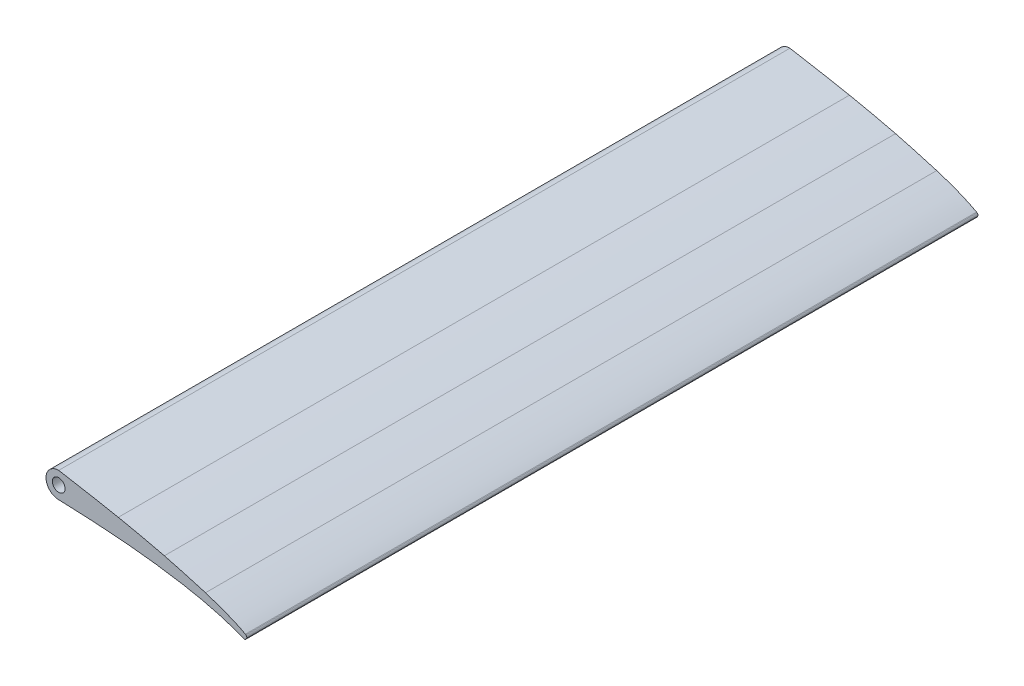
ISO-10303-21;
HEADER;
FILE_DESCRIPTION(('STEP AP214'),'2;1');
FILE_NAME('part.step','',(''),(''),'','','');
FILE_SCHEMA(('AUTOMOTIVE_DESIGN { 1 0 10303 214 1 1 1 1 }'));
ENDSEC;
DATA;
#1=APPLICATION_CONTEXT('core data for automotive mechanical design processes');
#2=APPLICATION_PROTOCOL_DEFINITION('international standard','automotive_design',2000,#1);
#3=PRODUCT_CONTEXT('',#1,'mechanical');
#4=PRODUCT('Part','Part','',(#3));
#5=PRODUCT_RELATED_PRODUCT_CATEGORY('part','',(#4));
#6=PRODUCT_DEFINITION_FORMATION('','',#4);
#7=PRODUCT_DEFINITION_CONTEXT('part definition',#1,'design');
#8=PRODUCT_DEFINITION('design','',#6,#7);
#9=PRODUCT_DEFINITION_SHAPE('','',#8);
#10=(LENGTH_UNIT() NAMED_UNIT(*) SI_UNIT(.MILLI.,.METRE.));
#11=(NAMED_UNIT(*) PLANE_ANGLE_UNIT() SI_UNIT($,.RADIAN.));
#12=(NAMED_UNIT(*) SI_UNIT($,.STERADIAN.) SOLID_ANGLE_UNIT());
#13=UNCERTAINTY_MEASURE_WITH_UNIT(LENGTH_MEASURE(1.E-05),#10,'distance_accuracy_value','');
#14=(GEOMETRIC_REPRESENTATION_CONTEXT(3) GLOBAL_UNCERTAINTY_ASSIGNED_CONTEXT((#13)) GLOBAL_UNIT_ASSIGNED_CONTEXT((#10,
#11,#12)) REPRESENTATION_CONTEXT('',''));
#15=CARTESIAN_POINT('',(0.,0.,0.));
#16=DIRECTION('',(0.,0.,1.));
#17=DIRECTION('',(1.,0.,0.));
#18=AXIS2_PLACEMENT_3D('',#15,#16,#17);
#19=CARTESIAN_POINT('',(136.000000000001,15.5,415.));
#20=DIRECTION('',(0.,0.,-1.));
#21=DIRECTION('',(-1.,0.,0.));
#22=AXIS2_PLACEMENT_3D('',#19,#20,#21);
#23=CYLINDRICAL_SURFACE('',#22,3.99999999999999);
#24=CARTESIAN_POINT('',(136.000000000001,15.5,185.));
#25=DIRECTION('',(0.,0.,1.));
#26=DIRECTION('',(1.,0.,0.));
#27=AXIS2_PLACEMENT_3D('',#24,#25,#26);
#28=CIRCLE('',#27,3.99999999999999);
#29=CARTESIAN_POINT('',(136.000000000001,19.5,185.));
#30=VERTEX_POINT('',#29);
#31=CARTESIAN_POINT('',(136.000000000001,11.5,185.));
#32=VERTEX_POINT('',#31);
#33=EDGE_CURVE('E166',#30,#32,#28,.T.);
#34=ORIENTED_EDGE('',*,*,#33,.T.);
#35=DIRECTION('',(0.,0.,-1.));
#36=VECTOR('',#35,1.);
#37=CARTESIAN_POINT('',(136.000000000001,11.5,415.));
#38=LINE('',#37,#36);
#39=CARTESIAN_POINT('',(136.000000000001,11.5,415.));
#40=VERTEX_POINT('',#39);
#41=EDGE_CURVE('E164',#40,#32,#38,.T.);
#42=ORIENTED_EDGE('',*,*,#41,.F.);
#43=CARTESIAN_POINT('',(136.000000000001,15.5,415.));
#44=DIRECTION('',(0.,0.,1.));
#45=DIRECTION('',(1.,0.,0.));
#46=AXIS2_PLACEMENT_3D('',#43,#44,#45);
#47=CIRCLE('',#46,3.99999999999999);
#48=CARTESIAN_POINT('',(136.000000000001,19.5,415.));
#49=VERTEX_POINT('',#48);
#50=EDGE_CURVE('E150',#49,#40,#47,.T.);
#51=ORIENTED_EDGE('',*,*,#50,.F.);
#52=DIRECTION('',(0.,0.,-1.));
#53=VECTOR('',#52,1.);
#54=CARTESIAN_POINT('',(136.000000000001,19.5,415.));
#55=LINE('',#54,#53);
#56=EDGE_CURVE('E379',#49,#30,#55,.T.);
#57=ORIENTED_EDGE('',*,*,#56,.T.);
#58=EDGE_LOOP('',(#34,#42,#51,#57));
#59=FACE_BOUND('',#58,.T.);
#60=ADVANCED_FACE('F74',(#59),#23,.T.);
#61=CARTESIAN_POINT('',(136.000000000001,11.5,415.));
#62=CARTESIAN_POINT('',(148.395543071831,11.0674892956404,415.));
#63=CARTESIAN_POINT('',(166.87047117622,9.92275481438999,415.));
#64=CARTESIAN_POINT('',(186.29183084274,5.77820347233618,415.));
#65=CARTESIAN_POINT('',(193.131484995105,3.18721761404227,415.));
#66=CARTESIAN_POINT('',(194.240981872188,2.73089845469326,415.));
#67=B_SPLINE_CURVE_WITH_KNOTS('',3,(#61,#62,#63,#64,#65,#66),.UNSPECIFIED.,.F.,.F.,(4,1,1,4),
(0.,0.567543772857326,0.847921019576535,0.902900843309906),.UNSPECIFIED.);
#68=DIRECTION('',(0.,0.,-1.));
#69=VECTOR('',#68,1.);
#70=SURFACE_OF_LINEAR_EXTRUSION('',#67,#69);
#71=CARTESIAN_POINT('',(136.000000000001,11.5,185.));
#72=CARTESIAN_POINT('',(148.395543071831,11.0674892956404,185.));
#73=CARTESIAN_POINT('',(166.87047117622,9.92275481438999,185.));
#74=CARTESIAN_POINT('',(186.29183084274,5.77820347233618,185.));
#75=CARTESIAN_POINT('',(193.131484995105,3.18721761404227,185.));
#76=CARTESIAN_POINT('',(194.240981872188,2.73089845469326,185.));
#77=B_SPLINE_CURVE_WITH_KNOTS('',3,(#71,#72,#73,#74,#75,#76),.UNSPECIFIED.,.F.,.F.,(4,1,1,4),
(0.,0.567543772857326,0.847921019576535,0.902900843309906),.UNSPECIFIED.);
#78=CARTESIAN_POINT('',(194.240981872188,2.73089845469329,185.));
#79=VERTEX_POINT('',#78);
#80=EDGE_CURVE('E172',#32,#79,#77,.T.);
#81=ORIENTED_EDGE('',*,*,#80,.T.);
#82=DIRECTION('',(0.,0.,-1.));
#83=VECTOR('',#82,1.);
#84=CARTESIAN_POINT('',(194.240981872188,2.73089845469329,415.));
#85=LINE('',#84,#83);
#86=CARTESIAN_POINT('',(194.240981872188,2.73089845469329,415.));
#87=VERTEX_POINT('',#86);
#88=EDGE_CURVE('E175',#87,#79,#85,.T.);
#89=ORIENTED_EDGE('',*,*,#88,.F.);
#90=EDGE_CURVE('E156',#40,#87,#67,.T.);
#91=ORIENTED_EDGE('',*,*,#90,.F.);
#92=ORIENTED_EDGE('',*,*,#41,.T.);
#93=EDGE_LOOP('',(#81,#89,#91,#92));
#94=FACE_BOUND('',#93,.T.);
#95=ADVANCED_FACE('F174',(#94),#70,.F.);
#96=CARTESIAN_POINT('',(194.431166998504,3.19331560157277,415.));
#97=DIRECTION('',(0.,0.,-1.));
#98=DIRECTION('',(-1.,0.,0.));
#99=AXIS2_PLACEMENT_3D('',#96,#97,#98);
#100=CYLINDRICAL_SURFACE('',#99,0.499999999999988);
#101=CARTESIAN_POINT('',(194.431166998504,3.19331560157277,185.));
#102=DIRECTION('',(0.,0.,1.));
#103=DIRECTION('',(1.,0.,0.));
#104=AXIS2_PLACEMENT_3D('',#101,#102,#103);
#105=CIRCLE('',#104,0.499999999999988);
#106=CARTESIAN_POINT('',(194.850331728796,2.92073363430524,185.));
#107=VERTEX_POINT('',#106);
#108=EDGE_CURVE('E84',#107,#79,#105,.F.);
#109=ORIENTED_EDGE('',*,*,#108,.F.);
#110=DIRECTION('',(0.,0.,-1.));
#111=VECTOR('',#110,1.);
#112=CARTESIAN_POINT('',(194.850331728796,2.92073363430524,415.));
#113=LINE('',#112,#111);
#114=CARTESIAN_POINT('',(194.850331728796,2.92073363430524,415.));
#115=VERTEX_POINT('',#114);
#116=EDGE_CURVE('E367',#115,#107,#113,.T.);
#117=ORIENTED_EDGE('',*,*,#116,.F.);
#118=CARTESIAN_POINT('',(194.431166998504,3.19331560157277,415.));
#119=DIRECTION('',(0.,0.,1.));
#120=DIRECTION('',(1.,0.,0.));
#121=AXIS2_PLACEMENT_3D('',#118,#119,#120);
#122=CIRCLE('',#121,0.499999999999988);
#123=EDGE_CURVE('E171',#115,#87,#122,.F.);
#124=ORIENTED_EDGE('',*,*,#123,.T.);
#125=ORIENTED_EDGE('',*,*,#88,.T.);
#126=EDGE_LOOP('',(#109,#117,#124,#125));
#127=FACE_BOUND('',#126,.T.);
#128=ADVANCED_FACE('F196',(#127),#100,.T.);
#129=CARTESIAN_POINT('',(135.605235075913,-88.1838071706198,415.));
#130=DIRECTION('',(0.838329460583484,-0.545163934535113,0.));
#131=DIRECTION('',(0.545163934535113,0.838329460583484,0.));
#132=AXIS2_PLACEMENT_3D('',#129,#130,#131);
#133=PLANE('',#132);
#134=DIRECTION('',(-0.545163934535113,-0.838329460583484,0.));
#135=VECTOR('',#134,1.);
#136=CARTESIAN_POINT('',(135.605235075913,-88.1838071706198,185.));
#137=LINE('',#136,#135);
#138=CARTESIAN_POINT('',(195.06760910792,3.25485336691923,185.));
#139=VERTEX_POINT('',#138);
#140=EDGE_CURVE('E273',#139,#107,#137,.T.);
#141=ORIENTED_EDGE('',*,*,#140,.F.);
#142=DIRECTION('',(0.,0.,-1.));
#143=VECTOR('',#142,1.);
#144=CARTESIAN_POINT('',(195.06760910792,3.25485336691923,415.));
#145=LINE('',#144,#143);
#146=CARTESIAN_POINT('',(195.06760910792,3.25485336691923,415.));
#147=VERTEX_POINT('',#146);
#148=EDGE_CURVE('E333',#147,#139,#145,.T.);
#149=ORIENTED_EDGE('',*,*,#148,.F.);
#150=DIRECTION('',(-0.545163934535113,-0.838329460583484,0.));
#151=VECTOR('',#150,1.);
#152=CARTESIAN_POINT('',(135.605235075913,-88.1838071706198,415.));
#153=LINE('',#152,#151);
#154=EDGE_CURVE('E391',#147,#115,#153,.T.);
#155=ORIENTED_EDGE('',*,*,#154,.T.);
#156=ORIENTED_EDGE('',*,*,#116,.T.);
#157=EDGE_LOOP('',(#141,#149,#155,#156));
#158=FACE_BOUND('',#157,.T.);
#159=ADVANCED_FACE('F199',(#158),#133,.T.);
#160=CARTESIAN_POINT('',(194.55234806543,3.58992656957235,415.));
#161=DIRECTION('',(0.,0.,-1.));
#162=DIRECTION('',(-1.,0.,0.));
#163=AXIS2_PLACEMENT_3D('',#160,#161,#162);
#164=CYLINDRICAL_SURFACE('',#163,0.614628337325445);
#165=CARTESIAN_POINT('',(194.55234806543,3.58992656957235,185.));
#166=DIRECTION('',(0.,0.,1.));
#167=DIRECTION('',(1.,0.,0.));
#168=AXIS2_PLACEMENT_3D('',#165,#166,#167);
#169=CIRCLE('',#168,0.614628337325445);
#170=CARTESIAN_POINT('',(194.895953658024,4.09953739145695,185.));
#171=VERTEX_POINT('',#170);
#172=EDGE_CURVE('E363',#139,#171,#169,.T.);
#173=ORIENTED_EDGE('',*,*,#172,.T.);
#174=DIRECTION('',(0.,0.,-1.));
#175=VECTOR('',#174,1.);
#176=CARTESIAN_POINT('',(194.895953658024,4.09953739145695,415.));
#177=LINE('',#176,#175);
#178=CARTESIAN_POINT('',(194.895953658024,4.09953739145695,415.));
#179=VERTEX_POINT('',#178);
#180=EDGE_CURVE('E324',#179,#171,#177,.T.);
#181=ORIENTED_EDGE('',*,*,#180,.F.);
#182=CARTESIAN_POINT('',(194.55234806543,3.58992656957235,415.));
#183=DIRECTION('',(0.,0.,1.));
#184=DIRECTION('',(1.,0.,0.));
#185=AXIS2_PLACEMENT_3D('',#182,#183,#184);
#186=CIRCLE('',#185,0.614628337325445);
#187=EDGE_CURVE('E178',#147,#179,#186,.T.);
#188=ORIENTED_EDGE('',*,*,#187,.F.);
#189=ORIENTED_EDGE('',*,*,#148,.T.);
#190=EDGE_LOOP('',(#173,#181,#188,#189));
#191=FACE_BOUND('',#190,.T.);
#192=ADVANCED_FACE('F203',(#191),#164,.T.);
#193=CARTESIAN_POINT('',(136.000000000001,19.5,415.));
#194=CARTESIAN_POINT('',(147.074321393544,17.5688786023036,415.));
#195=CARTESIAN_POINT('',(162.773097120995,14.8555018047728,415.));
#196=CARTESIAN_POINT('',(182.131254264111,9.28069770205282,415.));
#197=CARTESIAN_POINT('',(191.053911608056,6.66333190396763,415.));
#198=CARTESIAN_POINT('',(194.833959330957,4.14133712681224,415.));
#199=CARTESIAN_POINT('',(194.895953658024,4.09953739145691,415.));
#200=B_SPLINE_CURVE_WITH_KNOTS('',3,(#193,#194,#195,#196,#197,#198,#199),.UNSPECIFIED.,.F.,.F.,
(4,1,1,1,4),(0.,0.478024786130533,0.667422079548377,0.857853102491149,0.86103820388393),.UNSPECIFIED.);
#201=DIRECTION('',(0.,0.,-1.));
#202=VECTOR('',#201,1.);
#203=SURFACE_OF_LINEAR_EXTRUSION('',#200,#202);
#204=CARTESIAN_POINT('',(136.000000000001,19.5,185.));
#205=CARTESIAN_POINT('',(147.074321393544,17.5688786023036,185.));
#206=CARTESIAN_POINT('',(162.773097120995,14.8555018047728,185.));
#207=CARTESIAN_POINT('',(182.131254264111,9.28069770205282,185.));
#208=CARTESIAN_POINT('',(191.053911608056,6.66333190396763,185.));
#209=CARTESIAN_POINT('',(194.833959330957,4.14133712681224,185.));
#210=CARTESIAN_POINT('',(194.895953658024,4.09953739145691,185.));
#211=B_SPLINE_CURVE_WITH_KNOTS('',3,(#204,#205,#206,#207,#208,#209,#210),.UNSPECIFIED.,.F.,.F.,
(4,1,1,1,4),(0.,0.478024786130533,0.667422079548377,0.857853102491149,0.86103820388393),.UNSPECIFIED.);
#212=CARTESIAN_POINT('',(194.709236023725,4.22409327266215,185.));
#213=VERTEX_POINT('',#212);
#214=EDGE_CURVE('E250',#213,#171,#211,.T.);
#215=ORIENTED_EDGE('',*,*,#214,.F.);
#216=DIRECTION('',(0.,0.,-1.));
#217=VECTOR('',#216,1.);
#218=CARTESIAN_POINT('',(194.709236023725,4.22409327266215,415.));
#219=LINE('',#218,#217);
#220=CARTESIAN_POINT('',(194.709236023725,4.22409327266215,415.));
#221=VERTEX_POINT('',#220);
#222=EDGE_CURVE('E321',#221,#213,#219,.T.);
#223=ORIENTED_EDGE('',*,*,#222,.F.);
#224=EDGE_CURVE('E329',#221,#179,#200,.T.);
#225=ORIENTED_EDGE('',*,*,#224,.T.);
#226=ORIENTED_EDGE('',*,*,#180,.T.);
#227=EDGE_LOOP('',(#215,#223,#225,#226));
#228=FACE_BOUND('',#227,.T.);
#229=ADVANCED_FACE('F207',(#228),#203,.T.);
#230=CARTESIAN_POINT('',(200.,1.0111764974874E-12,415.));
#231=CARTESIAN_POINT('',(200.001197322403,0.00509143906549315,415.));
#232=CARTESIAN_POINT('',(199.343723834862,0.4949539713453,415.));
#233=CARTESIAN_POINT('',(198.78768375202,1.04052561958742,415.));
#234=CARTESIAN_POINT('',(197.553050156025,2.18005944651018,415.));
#235=CARTESIAN_POINT('',(196.096471176472,3.39230553969644,415.));
#236=CARTESIAN_POINT('',(194.103996242016,4.61438448115632,415.));
#237=CARTESIAN_POINT('',(191.62633851676,5.79871713181462,415.));
#238=CARTESIAN_POINT('',(188.635222538712,7.03471170352151,415.));
#239=CARTESIAN_POINT('',(185.135207646673,8.30515811658273,415.));
#240=CARTESIAN_POINT('',(181.142622455124,9.60108161032059,415.));
#241=CARTESIAN_POINT('',(176.678193866901,10.9112304799641,415.));
#242=CARTESIAN_POINT('',(171.766921437582,12.2294555160268,415.));
#243=CARTESIAN_POINT('',(166.435923091194,13.5436528948874,415.));
#244=CARTESIAN_POINT('',(160.71576283255,14.8443092046965,415.));
#245=CARTESIAN_POINT('',(154.6405342269,16.1233005548517,415.));
#246=CARTESIAN_POINT('',(148.247335438005,17.3740519524164,415.));
#247=CARTESIAN_POINT('',(141.573531842256,18.5811721631699,415.));
#248=CARTESIAN_POINT('',(134.661149635672,19.7429365580831,415.));
#249=CARTESIAN_POINT('',(127.550025427685,20.844385187064,415.));
#250=CARTESIAN_POINT('',(120.286147042683,21.8876688440754,415.));
#251=CARTESIAN_POINT('',(112.91606727042,22.8645200265459,415.));
#252=CARTESIAN_POINT('',(105.493167632805,23.7718128641816,415.));
#253=CARTESIAN_POINT('',(98.0767885821031,24.615971482177,415.));
#254=CARTESIAN_POINT('',(90.7283266909664,25.3756955781922,415.));
#255=CARTESIAN_POINT('',(83.5076487532346,26.0367660521594,415.));
#256=CARTESIAN_POINT('',(76.4655391160669,26.5619742473018,415.));
#257=CARTESIAN_POINT('',(69.6422248954517,26.9232500776958,415.));
#258=CARTESIAN_POINT('',(63.0756664187172,27.0792658142907,415.));
#259=CARTESIAN_POINT('',(56.7995032312665,27.062658958427,415.));
#260=CARTESIAN_POINT('',(50.8254428053149,26.7553596583695,415.));
#261=CARTESIAN_POINT('',(45.1511709531699,26.1326314700539,415.));
#262=CARTESIAN_POINT('',(39.7535889835635,25.2520845769776,415.));
#263=CARTESIAN_POINT('',(34.6313941853386,24.1113438504202,415.));
#264=CARTESIAN_POINT('',(29.7898488666238,22.7736662235122,415.));
#265=CARTESIAN_POINT('',(25.2494382038678,21.2627440151135,415.));
#266=CARTESIAN_POINT('',(21.0294721449092,19.6139101954432,415.));
#267=CARTESIAN_POINT('',(17.1561740530911,17.8359986103761,415.));
#268=CARTESIAN_POINT('',(13.6419654113672,15.9651059797815,415.));
#269=CARTESIAN_POINT('',(10.5059646694063,14.0225079669084,415.));
#270=CARTESIAN_POINT('',(7.76783801204016,12.0345284596924,415.));
#271=CARTESIAN_POINT('',(5.4287151876847,10.0433050896597,415.));
#272=CARTESIAN_POINT('',(3.52251758710888,8.02710215732915,415.));
#273=CARTESIAN_POINT('',(2.0583146904946,6.00338002340086,415.));
#274=CARTESIAN_POINT('',(0.976744888162208,4.03456789725232,415.));
#275=CARTESIAN_POINT('',(0.283573105496305,2.16527406269492,415.));
#276=CARTESIAN_POINT('',(-0.0467232825455219,0.439916418835076,415.));
#277=CARTESIAN_POINT('',(0.0170328591764663,-1.01932719226086,415.));
#278=CARTESIAN_POINT('',(0.392720816536618,-2.3576887199177,415.));
#279=CARTESIAN_POINT('',(1.7892131112896,-3.02206118685336,415.));
#280=CARTESIAN_POINT('',(3.66681533846569,-3.11527055159971,415.));
#281=CARTESIAN_POINT('',(6.23536818502624,-3.20560943447868,415.));
#282=CARTESIAN_POINT('',(9.46550466670624,-3.06631916673476,415.));
#283=CARTESIAN_POINT('',(13.3207178606136,-2.81034610290133,415.));
#284=CARTESIAN_POINT('',(17.7581032681479,-2.4003327612533,415.));
#285=CARTESIAN_POINT('',(22.7322541397173,-1.84556708110915,415.));
#286=CARTESIAN_POINT('',(28.218915208659,-1.13414479173941,415.));
#287=CARTESIAN_POINT('',(34.215405224652,-0.139826286057133,415.));
#288=CARTESIAN_POINT('',(40.7509205831387,1.10703300248549,415.));
#289=CARTESIAN_POINT('',(47.8581344616859,2.4640137920198,415.));
#290=CARTESIAN_POINT('',(55.5023073787536,3.89679096016649,415.));
#291=CARTESIAN_POINT('',(63.635425888827,5.34589450011042,415.));
#292=CARTESIAN_POINT('',(72.1977600784763,6.75694125546724,415.));
#293=CARTESIAN_POINT('',(81.1228827641105,8.08281268262065,415.));
#294=CARTESIAN_POINT('',(90.3338776499013,9.27487104846574,415.));
#295=CARTESIAN_POINT('',(99.747912838175,10.2984064898528,415.));
#296=CARTESIAN_POINT('',(109.276060567501,11.1074691118933,415.));
#297=CARTESIAN_POINT('',(118.822703527262,11.680994749193,415.));
#298=CARTESIAN_POINT('',(128.288103804436,11.9962935596577,415.));
#299=CARTESIAN_POINT('',(137.569578416084,12.0361180585512,415.));
#300=CARTESIAN_POINT('',(146.563577976465,11.7977623570971,415.));
#301=CARTESIAN_POINT('',(155.167115862484,11.2868064087136,415.));
#302=CARTESIAN_POINT('',(163.27673574926,10.5098429210757,415.));
#303=CARTESIAN_POINT('',(170.795887756455,9.49669555027638,415.));
#304=CARTESIAN_POINT('',(177.626674932746,8.27676201415833,415.));
#305=CARTESIAN_POINT('',(183.689009323179,6.89089939865206,415.));
#306=CARTESIAN_POINT('',(188.871164889632,5.40796465995903,415.));
#307=CARTESIAN_POINT('',(193.112224788115,3.82524868459098,415.));
#308=CARTESIAN_POINT('',(196.138111854632,2.37686093933662,415.));
#309=CARTESIAN_POINT('',(198.36901761058,1.03763297975943,415.));
#310=CARTESIAN_POINT('',(199.226035669763,0.519373851867693,415.));
#311=CARTESIAN_POINT('',(199.998778336141,-0.00519494755934058,415.));
#312=CARTESIAN_POINT('',(200.,1.0111764974874E-12,415.));
#313=B_SPLINE_CURVE_WITH_KNOTS('',3,(#230,#231,#232,#233,#234,#235,#236,#237,#238,#239,#240,
#241,#242,#243,#244,#245,#246,#247,#248,#249,#250,#251,#252,#253,#254,#255,#256,#257,#258,#259,
#260,#261,#262,#263,#264,#265,#266,#267,#268,#269,#270,#271,#272,#273,#274,#275,#276,#277,#278,
#279,#280,#281,#282,#283,#284,#285,#286,#287,#288,#289,#290,#291,#292,#293,#294,#295,#296,#297,
#298,#299,#300,#301,#302,#303,#304,#305,#306,#307,#308,#309,#310,#311,#312),.UNSPECIFIED.,.T.,
.F.,(4,1,1,1,1,1,1,1,1,1,1,1,1,1,1,1,1,1,1,1,1,1,1,1,1,1,1,1,1,1,1,1,1,1,1,1,1,1,1,1,1,1,1,1,1,
1,1,1,1,1,1,1,1,1,1,1,1,1,1,1,1,1,1,1,1,1,1,1,1,1,1,1,1,1,1,1,1,1,1,1,4),(0.,
0.000979677557134192,0.00364886216776308,0.00748349851947817,0.0120952771855933,
0.0175255907768788,0.0240517799938711,0.0317830505527586,0.0406778280832619,0.050710300790478,
0.0618332290621794,0.0739892504845854,0.0871181731906812,0.101145048769791,0.115990637111827,
0.131570421640589,0.147788379302961,0.164550916882416,0.181757895150531,0.199311954944345,
0.217095071712264,0.234990228463986,0.252856883122009,0.270540593729572,0.287886779266045,
0.304773437599674,0.321101419214061,0.336806063174811,0.351800032584037,0.366031063392082,
0.379615674919835,0.392652962879186,0.405170358707495,0.417171919049936,0.428603516911185,
0.43941895910826,0.449596586064162,0.459102079103161,0.467907877534646,0.475988300736527,
0.483308968746149,0.489874507816402,0.495803249719208,0.501149411695553,0.50590307325604,
0.510046768536663,0.513579310681042,0.516446926626751,0.5193500525909,0.523823355179486,
0.529973793997694,0.537715654387927,0.546967844488146,0.55763736682571,0.569620481096633,
0.582804124215616,0.597246960791633,0.613135036654701,0.630443600329816,0.649056123608546,
0.668822256795696,0.689594964002685,0.711189650864602,0.733426688964389,0.756094117504156,
0.778988553684861,0.801889682684955,0.824566597829707,0.846792284880412,0.868338290507787,
0.888978162959066,0.908492011340558,0.926658767581933,0.943286193042322,0.958169210358794,
0.971135821634751,0.981955623079976,0.990251791025976,0.995852565249962,0.999000405686701,1.),.UNSPECIFIED.);
#314=DIRECTION('',(0.,0.,-1.));
#315=VECTOR('',#314,1.);
#316=SURFACE_OF_LINEAR_EXTRUSION('',#313,#315);
#317=CARTESIAN_POINT('',(194.709236023725,4.22409327266213,185.));
#318=CARTESIAN_POINT('',(194.547956871505,4.31813921776328,185.));
#319=CARTESIAN_POINT('',(193.588056152404,4.86100639655722,185.));
#320=CARTESIAN_POINT('',(191.62633851676,5.79871713181462,185.));
#321=CARTESIAN_POINT('',(188.635222538712,7.03471170352151,185.));
#322=CARTESIAN_POINT('',(185.429096003385,8.19848159658428,185.));
#323=CARTESIAN_POINT('',(183.214862201431,8.9271340506628,185.));
#324=CARTESIAN_POINT('',(182.177060941007,9.25571960351134,185.));
#325=B_SPLINE_CURVE_WITH_KNOTS('',3,(#317,#318,#319,#320,#321,#322,#323,#324),.UNSPECIFIED.,.F.,
.F.,(4,1,1,1,1,4),(0.0161950006670748,0.0175255907768788,0.0240517799938711,0.0317830505527586,
0.0406778280832619,0.0484718449235865),.UNSPECIFIED.);
#326=CARTESIAN_POINT('',(182.177060941007,9.25571960351134,185.));
#327=VERTEX_POINT('',#326);
#328=EDGE_CURVE('E319',#213,#327,#325,.T.);
#329=ORIENTED_EDGE('',*,*,#328,.T.);
#330=DIRECTION('',(0.,0.,-1.));
#331=VECTOR('',#330,1.);
#332=CARTESIAN_POINT('',(182.177060941007,9.25571960351134,415.));
#333=LINE('',#332,#331);
#334=CARTESIAN_POINT('',(182.177060941007,9.25571960351134,415.));
#335=VERTEX_POINT('',#334);
#336=EDGE_CURVE('E309',#335,#327,#333,.T.);
#337=ORIENTED_EDGE('',*,*,#336,.F.);
#338=CARTESIAN_POINT('',(182.177060941007,9.25571960351134,415.));
#339=CARTESIAN_POINT('',(183.214862201431,8.9271340506628,415.));
#340=CARTESIAN_POINT('',(185.429096003385,8.19848159658428,415.));
#341=CARTESIAN_POINT('',(188.635222538712,7.03471170352151,415.));
#342=CARTESIAN_POINT('',(191.62633851676,5.79871713181462,415.));
#343=CARTESIAN_POINT('',(193.588056152404,4.86100639655722,415.));
#344=CARTESIAN_POINT('',(194.547956871505,4.31813921776328,415.));
#345=CARTESIAN_POINT('',(194.709236023725,4.22409327266213,415.));
#346=B_SPLINE_CURVE_WITH_KNOTS('',3,(#338,#339,#340,#341,#342,#343,#344,#345),.UNSPECIFIED.,.F.,
.F.,(4,1,1,1,1,4),(0.0161950006670748,0.0239890175073995,0.0328837950379027,0.0406150655967902,
0.0471412548137825,0.0484718449235865),.UNSPECIFIED.);
#347=EDGE_CURVE('E181',#221,#335,#346,.F.);
#348=ORIENTED_EDGE('',*,*,#347,.F.);
#349=ORIENTED_EDGE('',*,*,#222,.T.);
#350=EDGE_LOOP('',(#329,#337,#348,#349));
#351=FACE_BOUND('',#350,.T.);
#352=ADVANCED_FACE('F213',(#351),#316,.F.);
#353=CARTESIAN_POINT('',(169.234467027616,12.8491681748908,185.));
#354=VERTEX_POINT('',#353);
#355=EDGE_CURVE('E244',#354,#327,#211,.T.);
#356=ORIENTED_EDGE('',*,*,#355,.F.);
#357=DIRECTION('',(0.,0.,-1.));
#358=VECTOR('',#357,1.);
#359=CARTESIAN_POINT('',(169.234467027616,12.8491681748908,415.));
#360=LINE('',#359,#358);
#361=CARTESIAN_POINT('',(169.234467027616,12.8491681748908,415.));
#362=VERTEX_POINT('',#361);
#363=EDGE_CURVE('E161',#362,#354,#360,.T.);
#364=ORIENTED_EDGE('',*,*,#363,.F.);
#365=EDGE_CURVE('E231',#362,#335,#200,.T.);
#366=ORIENTED_EDGE('',*,*,#365,.T.);
#367=ORIENTED_EDGE('',*,*,#336,.T.);
#368=EDGE_LOOP('',(#356,#364,#366,#367));
#369=FACE_BOUND('',#368,.T.);
#370=ADVANCED_FACE('F209',(#369),#203,.T.);
#371=CARTESIAN_POINT('',(169.234467027616,12.8491681748908,185.));
#372=CARTESIAN_POINT('',(168.342003845553,13.0696523077998,185.));
#373=CARTESIAN_POINT('',(165.544341818344,13.7463816220218,185.));
#374=CARTESIAN_POINT('',(160.718304442024,14.8437312907483,185.));
#375=CARTESIAN_POINT('',(156.77490336887,15.6739611116733,185.));
#376=CARTESIAN_POINT('',(154.745662469605,16.0864425287819,185.));
#377=B_SPLINE_CURVE_WITH_KNOTS('',3,(#371,#372,#373,#374,#375,#376),.UNSPECIFIED.,.F.,.F.,(4,1,
1,4),(0.0805358589810862,0.0871181731906812,0.101145048769791,0.115971974851098),.UNSPECIFIED.);
#378=CARTESIAN_POINT('',(154.745662469598,16.0864425287832,185.));
#379=VERTEX_POINT('',#378);
#380=EDGE_CURVE('E297',#354,#379,#377,.T.);
#381=ORIENTED_EDGE('',*,*,#380,.T.);
#382=DIRECTION('',(0.,0.,-1.));
#383=VECTOR('',#382,1.);
#384=CARTESIAN_POINT('',(154.745662469598,16.0864425287832,415.));
#385=LINE('',#384,#383);
#386=CARTESIAN_POINT('',(154.745662469598,16.0864425287832,415.));
#387=VERTEX_POINT('',#386);
#388=EDGE_CURVE('E91',#387,#379,#385,.T.);
#389=ORIENTED_EDGE('',*,*,#388,.F.);
#390=CARTESIAN_POINT('',(154.745662469605,16.0864425287819,415.));
#391=CARTESIAN_POINT('',(156.77490336887,15.6739611116733,415.));
#392=CARTESIAN_POINT('',(160.718304442024,14.8437312907483,415.));
#393=CARTESIAN_POINT('',(165.544341818344,13.7463816220218,415.));
#394=CARTESIAN_POINT('',(168.342003845553,13.0696523077998,415.));
#395=CARTESIAN_POINT('',(169.234467027616,12.8491681748908,415.));
#396=B_SPLINE_CURVE_WITH_KNOTS('',3,(#390,#391,#392,#393,#394,#395),.UNSPECIFIED.,.F.,.F.,(4,1,
1,4),(0.0805358589810862,0.0953627850623931,0.109389660641503,0.115971974851098),.UNSPECIFIED.);
#397=EDGE_CURVE('E355',#362,#387,#396,.F.);
#398=ORIENTED_EDGE('',*,*,#397,.F.);
#399=ORIENTED_EDGE('',*,*,#363,.T.);
#400=EDGE_LOOP('',(#381,#389,#398,#399));
#401=FACE_BOUND('',#400,.T.);
#402=ADVANCED_FACE('F212',(#401),#316,.F.);
#403=CARTESIAN_POINT('',(0.,0.,415.));
#404=DIRECTION('',(0.,0.,1.));
#405=DIRECTION('',(1.,0.,0.));
#406=AXIS2_PLACEMENT_3D('',#403,#404,#405);
#407=PLANE('',#406);
#408=EDGE_CURVE('E158',#49,#387,#200,.T.);
#409=ORIENTED_EDGE('',*,*,#408,.F.);
#410=ORIENTED_EDGE('',*,*,#50,.T.);
#411=ORIENTED_EDGE('',*,*,#90,.T.);
#412=ORIENTED_EDGE('',*,*,#123,.F.);
#413=ORIENTED_EDGE('',*,*,#154,.F.);
#414=ORIENTED_EDGE('',*,*,#187,.T.);
#415=ORIENTED_EDGE('',*,*,#224,.F.);
#416=ORIENTED_EDGE('',*,*,#347,.T.);
#417=ORIENTED_EDGE('',*,*,#365,.F.);
#418=ORIENTED_EDGE('',*,*,#397,.T.);
#419=EDGE_LOOP('',(#409,#410,#411,#412,#413,#414,#415,#416,#417,#418));
#420=FACE_BOUND('',#419,.T.);
#421=CARTESIAN_POINT('',(136.000000000001,15.5,415.));
#422=DIRECTION('',(0.,0.,1.));
#423=DIRECTION('',(1.,0.,0.));
#424=AXIS2_PLACEMENT_3D('',#421,#422,#423);
#425=CIRCLE('',#424,2.);
#426=CARTESIAN_POINT('',(138.000000000001,15.5,415.));
#427=VERTEX_POINT('',#426);
#428=EDGE_CURVE('E222',#427,#427,#425,.F.);
#429=ORIENTED_EDGE('',*,*,#428,.T.);
#430=EDGE_LOOP('',(#429));
#431=FACE_BOUND('',#430,.T.);
#432=ADVANCED_FACE('F152',(#420,#431),#407,.T.);
#433=EDGE_CURVE('E241',#30,#379,#211,.T.);
#434=ORIENTED_EDGE('',*,*,#433,.F.);
#435=ORIENTED_EDGE('',*,*,#56,.F.);
#436=ORIENTED_EDGE('',*,*,#408,.T.);
#437=ORIENTED_EDGE('',*,*,#388,.T.);
#438=EDGE_LOOP('',(#434,#435,#436,#437));
#439=FACE_BOUND('',#438,.T.);
#440=ADVANCED_FACE('F215',(#439),#203,.T.);
#441=CARTESIAN_POINT('',(0.,0.,185.));
#442=DIRECTION('',(0.,0.,1.));
#443=DIRECTION('',(1.,0.,0.));
#444=AXIS2_PLACEMENT_3D('',#441,#442,#443);
#445=PLANE('',#444);
#446=ORIENTED_EDGE('',*,*,#433,.T.);
#447=ORIENTED_EDGE('',*,*,#380,.F.);
#448=ORIENTED_EDGE('',*,*,#355,.T.);
#449=ORIENTED_EDGE('',*,*,#328,.F.);
#450=ORIENTED_EDGE('',*,*,#214,.T.);
#451=ORIENTED_EDGE('',*,*,#172,.F.);
#452=ORIENTED_EDGE('',*,*,#140,.T.);
#453=ORIENTED_EDGE('',*,*,#108,.T.);
#454=ORIENTED_EDGE('',*,*,#80,.F.);
#455=ORIENTED_EDGE('',*,*,#33,.F.);
#456=EDGE_LOOP('',(#446,#447,#448,#449,#450,#451,#452,#453,#454,#455));
#457=FACE_BOUND('',#456,.T.);
#458=CARTESIAN_POINT('',(136.000000000001,15.5,185.));
#459=DIRECTION('',(0.,0.,1.));
#460=DIRECTION('',(1.,0.,0.));
#461=AXIS2_PLACEMENT_3D('',#458,#459,#460);
#462=CIRCLE('',#461,2.);
#463=CARTESIAN_POINT('',(138.000000000001,15.5,185.));
#464=VERTEX_POINT('',#463);
#465=EDGE_CURVE('E12',#464,#464,#462,.F.);
#466=ORIENTED_EDGE('',*,*,#465,.F.);
#467=EDGE_LOOP('',(#466));
#468=FACE_BOUND('',#467,.T.);
#469=ADVANCED_FACE('F279',(#457,#468),#445,.F.);
#470=CARTESIAN_POINT('',(136.000000000001,15.5,-320.));
#471=DIRECTION('',(0.,0.,1.));
#472=DIRECTION('',(1.,0.,0.));
#473=AXIS2_PLACEMENT_3D('',#470,#471,#472);
#474=CYLINDRICAL_SURFACE('',#473,2.);
#475=ORIENTED_EDGE('',*,*,#428,.F.);
#476=EDGE_LOOP('',(#475));
#477=FACE_BOUND('',#476,.T.);
#478=ORIENTED_EDGE('',*,*,#465,.T.);
#479=EDGE_LOOP('',(#478));
#480=FACE_BOUND('',#479,.T.);
#481=ADVANCED_FACE('F76',(#477,#480),#474,.F.);
#482=CLOSED_SHELL('',(#60,#95,#128,#159,#192,#229,#352,#370,#402,#432,#440,#469,#481));
#483=MANIFOLD_SOLID_BREP('B2',#482);
#484=ADVANCED_BREP_SHAPE_REPRESENTATION('',(#18,#483),#14);
#485=SHAPE_DEFINITION_REPRESENTATION(#9,#484);
ENDSEC;
END-ISO-10303-21;
